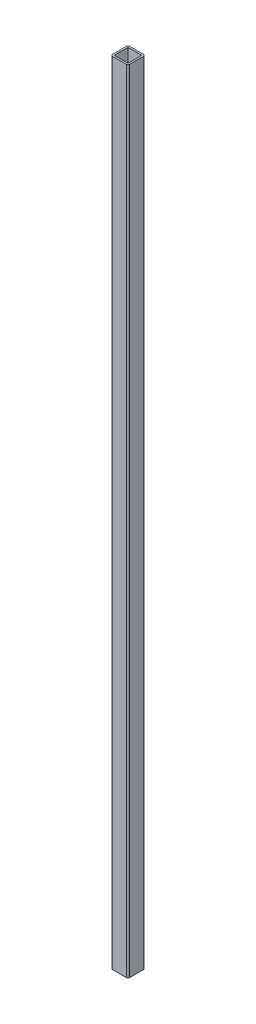
ISO-10303-21;
HEADER;
FILE_DESCRIPTION(('STEP AP214'),'2;1');
FILE_NAME('part.step','',(''),(''),'','','');
FILE_SCHEMA(('AUTOMOTIVE_DESIGN { 1 0 10303 214 1 1 1 1 }'));
ENDSEC;
DATA;
#1=APPLICATION_CONTEXT('core data for automotive mechanical design processes');
#2=APPLICATION_PROTOCOL_DEFINITION('international standard','automotive_design',2000,#1);
#3=PRODUCT_CONTEXT('',#1,'mechanical');
#4=PRODUCT('Part','Part','',(#3));
#5=PRODUCT_RELATED_PRODUCT_CATEGORY('part','',(#4));
#6=PRODUCT_DEFINITION_FORMATION('','',#4);
#7=PRODUCT_DEFINITION_CONTEXT('part definition',#1,'design');
#8=PRODUCT_DEFINITION('design','',#6,#7);
#9=PRODUCT_DEFINITION_SHAPE('','',#8);
#10=(LENGTH_UNIT() NAMED_UNIT(*) SI_UNIT(.MILLI.,.METRE.));
#11=(NAMED_UNIT(*) PLANE_ANGLE_UNIT() SI_UNIT($,.RADIAN.));
#12=(NAMED_UNIT(*) SI_UNIT($,.STERADIAN.) SOLID_ANGLE_UNIT());
#13=UNCERTAINTY_MEASURE_WITH_UNIT(LENGTH_MEASURE(1.E-05),#10,'distance_accuracy_value','');
#14=(GEOMETRIC_REPRESENTATION_CONTEXT(3) GLOBAL_UNCERTAINTY_ASSIGNED_CONTEXT((#13)) GLOBAL_UNIT_ASSIGNED_CONTEXT((#10,
#11,#12)) REPRESENTATION_CONTEXT('',''));
#15=CARTESIAN_POINT('',(0.,0.,0.));
#16=DIRECTION('',(0.,0.,1.));
#17=DIRECTION('',(1.,0.,0.));
#18=AXIS2_PLACEMENT_3D('',#15,#16,#17);
#19=CARTESIAN_POINT('',(12.7,1168.4,-12.7));
#20=DIRECTION('',(0.,0.,1.));
#21=DIRECTION('',(1.,0.,0.));
#22=AXIS2_PLACEMENT_3D('',#19,#20,#21);
#23=PLANE('',#22);
#24=DIRECTION('',(-1.,0.,0.));
#25=VECTOR('',#24,1.);
#26=CARTESIAN_POINT('',(12.7,1168.4,-12.7));
#27=LINE('',#26,#25);
#28=CARTESIAN_POINT('',(10.16,1168.4,-12.7));
#29=VERTEX_POINT('',#28);
#30=CARTESIAN_POINT('',(-10.16,1168.4,-12.7));
#31=VERTEX_POINT('',#30);
#32=EDGE_CURVE('E169',#29,#31,#27,.T.);
#33=ORIENTED_EDGE('',*,*,#32,.F.);
#34=DIRECTION('',(0.,-1.,0.));
#35=VECTOR('',#34,1.);
#36=CARTESIAN_POINT('',(10.16,0.,-12.7));
#37=LINE('',#36,#35);
#38=CARTESIAN_POINT('',(10.16,0.,-12.7));
#39=VERTEX_POINT('',#38);
#40=EDGE_CURVE('E11',#29,#39,#37,.T.);
#41=ORIENTED_EDGE('',*,*,#40,.T.);
#42=DIRECTION('',(-1.,0.,0.));
#43=VECTOR('',#42,1.);
#44=CARTESIAN_POINT('',(12.7,0.,-12.7));
#45=LINE('',#44,#43);
#46=CARTESIAN_POINT('',(-10.16,0.,-12.7));
#47=VERTEX_POINT('',#46);
#48=EDGE_CURVE('E182',#39,#47,#45,.T.);
#49=ORIENTED_EDGE('',*,*,#48,.T.);
#50=DIRECTION('',(0.,-1.,0.));
#51=VECTOR('',#50,1.);
#52=CARTESIAN_POINT('',(-10.16,1168.4,-12.7));
#53=LINE('',#52,#51);
#54=EDGE_CURVE('E47',#47,#31,#53,.F.);
#55=ORIENTED_EDGE('',*,*,#54,.T.);
#56=EDGE_LOOP('',(#33,#41,#49,#55));
#57=FACE_BOUND('',#56,.T.);
#58=ADVANCED_FACE('F39',(#57),#23,.F.);
#59=CARTESIAN_POINT('',(-12.7,1168.4,-12.7));
#60=DIRECTION('',(1.,0.,0.));
#61=DIRECTION('',(0.,0.,-1.));
#62=AXIS2_PLACEMENT_3D('',#59,#60,#61);
#63=PLANE('',#62);
#64=DIRECTION('',(0.,0.,1.));
#65=VECTOR('',#64,1.);
#66=CARTESIAN_POINT('',(-12.7,0.,-12.7));
#67=LINE('',#66,#65);
#68=CARTESIAN_POINT('',(-12.7,0.,-10.16));
#69=VERTEX_POINT('',#68);
#70=CARTESIAN_POINT('',(-12.7,0.,10.16));
#71=VERTEX_POINT('',#70);
#72=EDGE_CURVE('E185',#69,#71,#67,.T.);
#73=ORIENTED_EDGE('',*,*,#72,.T.);
#74=DIRECTION('',(0.,-1.,0.));
#75=VECTOR('',#74,1.);
#76=CARTESIAN_POINT('',(-12.7,1168.4,10.16));
#77=LINE('',#76,#75);
#78=CARTESIAN_POINT('',(-12.7,1168.4,10.16));
#79=VERTEX_POINT('',#78);
#80=EDGE_CURVE('E208',#71,#79,#77,.F.);
#81=ORIENTED_EDGE('',*,*,#80,.T.);
#82=DIRECTION('',(0.,0.,1.));
#83=VECTOR('',#82,1.);
#84=CARTESIAN_POINT('',(-12.7,1168.4,-12.7));
#85=LINE('',#84,#83);
#86=CARTESIAN_POINT('',(-12.7,1168.4,-10.16));
#87=VERTEX_POINT('',#86);
#88=EDGE_CURVE('E172',#87,#79,#85,.T.);
#89=ORIENTED_EDGE('',*,*,#88,.F.);
#90=DIRECTION('',(0.,-1.,0.));
#91=VECTOR('',#90,1.);
#92=CARTESIAN_POINT('',(-12.7,1168.4,-10.16));
#93=LINE('',#92,#91);
#94=EDGE_CURVE('E205',#87,#69,#93,.T.);
#95=ORIENTED_EDGE('',*,*,#94,.T.);
#96=EDGE_LOOP('',(#73,#81,#89,#95));
#97=FACE_BOUND('',#96,.T.);
#98=ADVANCED_FACE('F233',(#97),#63,.F.);
#99=CARTESIAN_POINT('',(12.7,1168.4,12.7));
#100=DIRECTION('',(0.,0.,1.));
#101=DIRECTION('',(1.,0.,0.));
#102=AXIS2_PLACEMENT_3D('',#99,#100,#101);
#103=PLANE('',#102);
#104=DIRECTION('',(-1.,0.,0.));
#105=VECTOR('',#104,1.);
#106=CARTESIAN_POINT('',(12.7,1168.4,12.7));
#107=LINE('',#106,#105);
#108=CARTESIAN_POINT('',(10.16,1168.4,12.7));
#109=VERTEX_POINT('',#108);
#110=CARTESIAN_POINT('',(-10.16,1168.4,12.7));
#111=VERTEX_POINT('',#110);
#112=EDGE_CURVE('E176',#109,#111,#107,.T.);
#113=ORIENTED_EDGE('',*,*,#112,.T.);
#114=DIRECTION('',(0.,-1.,0.));
#115=VECTOR('',#114,1.);
#116=CARTESIAN_POINT('',(-10.16,0.,12.7));
#117=LINE('',#116,#115);
#118=CARTESIAN_POINT('',(-10.16,0.,12.7));
#119=VERTEX_POINT('',#118);
#120=EDGE_CURVE('E194',#111,#119,#117,.T.);
#121=ORIENTED_EDGE('',*,*,#120,.T.);
#122=DIRECTION('',(-1.,0.,0.));
#123=VECTOR('',#122,1.);
#124=CARTESIAN_POINT('',(12.7,0.,12.7));
#125=LINE('',#124,#123);
#126=CARTESIAN_POINT('',(10.16,0.,12.7));
#127=VERTEX_POINT('',#126);
#128=EDGE_CURVE('E188',#127,#119,#125,.T.);
#129=ORIENTED_EDGE('',*,*,#128,.F.);
#130=DIRECTION('',(0.,-1.,0.));
#131=VECTOR('',#130,1.);
#132=CARTESIAN_POINT('',(10.16,1168.4,12.7));
#133=LINE('',#132,#131);
#134=EDGE_CURVE('E181',#127,#109,#133,.F.);
#135=ORIENTED_EDGE('',*,*,#134,.T.);
#136=EDGE_LOOP('',(#113,#121,#129,#135));
#137=FACE_BOUND('',#136,.T.);
#138=ADVANCED_FACE('F241',(#137),#103,.T.);
#139=CARTESIAN_POINT('',(12.7,1168.4,-12.7));
#140=DIRECTION('',(1.,0.,0.));
#141=DIRECTION('',(0.,0.,-1.));
#142=AXIS2_PLACEMENT_3D('',#139,#140,#141);
#143=PLANE('',#142);
#144=DIRECTION('',(0.,0.,1.));
#145=VECTOR('',#144,1.);
#146=CARTESIAN_POINT('',(12.7,1168.4,-12.7));
#147=LINE('',#146,#145);
#148=CARTESIAN_POINT('',(12.7,1168.4,-10.16));
#149=VERTEX_POINT('',#148);
#150=CARTESIAN_POINT('',(12.7,1168.4,10.16));
#151=VERTEX_POINT('',#150);
#152=EDGE_CURVE('E179',#149,#151,#147,.T.);
#153=ORIENTED_EDGE('',*,*,#152,.T.);
#154=DIRECTION('',(0.,-1.,0.));
#155=VECTOR('',#154,1.);
#156=CARTESIAN_POINT('',(12.7,1168.4,10.16));
#157=LINE('',#156,#155);
#158=CARTESIAN_POINT('',(12.7,0.,10.16));
#159=VERTEX_POINT('',#158);
#160=EDGE_CURVE('E218',#151,#159,#157,.T.);
#161=ORIENTED_EDGE('',*,*,#160,.T.);
#162=DIRECTION('',(0.,0.,1.));
#163=VECTOR('',#162,1.);
#164=CARTESIAN_POINT('',(12.7,0.,-12.7));
#165=LINE('',#164,#163);
#166=CARTESIAN_POINT('',(12.7,0.,-10.16));
#167=VERTEX_POINT('',#166);
#168=EDGE_CURVE('E173',#167,#159,#165,.T.);
#169=ORIENTED_EDGE('',*,*,#168,.F.);
#170=DIRECTION('',(0.,-1.,0.));
#171=VECTOR('',#170,1.);
#172=CARTESIAN_POINT('',(12.7,1168.4,-10.16));
#173=LINE('',#172,#171);
#174=EDGE_CURVE('E61',#167,#149,#173,.F.);
#175=ORIENTED_EDGE('',*,*,#174,.T.);
#176=EDGE_LOOP('',(#153,#161,#169,#175));
#177=FACE_BOUND('',#176,.T.);
#178=ADVANCED_FACE('F246',(#177),#143,.T.);
#179=CARTESIAN_POINT('',(0.,1168.4,0.));
#180=DIRECTION('',(0.,1.,0.));
#181=DIRECTION('',(0.,0.,1.));
#182=AXIS2_PLACEMENT_3D('',#179,#180,#181);
#183=PLANE('',#182);
#184=DIRECTION('',(-1.,0.,0.));
#185=VECTOR('',#184,1.);
#186=CARTESIAN_POINT('',(12.7,1168.4,-10.16));
#187=LINE('',#186,#185);
#188=CARTESIAN_POINT('',(10.16,1168.4,-10.16));
#189=VERTEX_POINT('',#188);
#190=CARTESIAN_POINT('',(-10.16,1168.4,-10.16));
#191=VERTEX_POINT('',#190);
#192=EDGE_CURVE('E156',#189,#191,#187,.T.);
#193=ORIENTED_EDGE('',*,*,#192,.F.);
#194=DIRECTION('',(0.,0.,1.));
#195=VECTOR('',#194,1.);
#196=CARTESIAN_POINT('',(10.16,1168.4,-12.7));
#197=LINE('',#196,#195);
#198=CARTESIAN_POINT('',(10.16,1168.4,10.16));
#199=VERTEX_POINT('',#198);
#200=EDGE_CURVE('E138',#189,#199,#197,.T.);
#201=ORIENTED_EDGE('',*,*,#200,.T.);
#202=DIRECTION('',(-1.,0.,0.));
#203=VECTOR('',#202,1.);
#204=CARTESIAN_POINT('',(12.7,1168.4,10.16));
#205=LINE('',#204,#203);
#206=CARTESIAN_POINT('',(-10.16,1168.4,10.16));
#207=VERTEX_POINT('',#206);
#208=EDGE_CURVE('E165',#199,#207,#205,.T.);
#209=ORIENTED_EDGE('',*,*,#208,.T.);
#210=DIRECTION('',(0.,0.,1.));
#211=VECTOR('',#210,1.);
#212=CARTESIAN_POINT('',(-10.16,1168.4,-12.7));
#213=LINE('',#212,#211);
#214=EDGE_CURVE('E158',#191,#207,#213,.T.);
#215=ORIENTED_EDGE('',*,*,#214,.F.);
#216=EDGE_LOOP('',(#193,#201,#209,#215));
#217=FACE_BOUND('',#216,.T.);
#218=ORIENTED_EDGE('',*,*,#88,.T.);
#219=CARTESIAN_POINT('',(-10.16,1168.4,10.16));
#220=DIRECTION('',(0.,1.,0.));
#221=DIRECTION('',(0.,0.,1.));
#222=AXIS2_PLACEMENT_3D('',#219,#220,#221);
#223=CIRCLE('',#222,2.54);
#224=EDGE_CURVE('E215',#79,#111,#223,.T.);
#225=ORIENTED_EDGE('',*,*,#224,.T.);
#226=ORIENTED_EDGE('',*,*,#112,.F.);
#227=CARTESIAN_POINT('',(10.16,1168.4,10.16));
#228=DIRECTION('',(0.,1.,0.));
#229=DIRECTION('',(0.,0.,1.));
#230=AXIS2_PLACEMENT_3D('',#227,#228,#229);
#231=CIRCLE('',#230,2.54);
#232=EDGE_CURVE('E54',#109,#151,#231,.T.);
#233=ORIENTED_EDGE('',*,*,#232,.T.);
#234=ORIENTED_EDGE('',*,*,#152,.F.);
#235=CARTESIAN_POINT('',(10.16,1168.4,-10.16));
#236=DIRECTION('',(0.,1.,0.));
#237=DIRECTION('',(0.,0.,1.));
#238=AXIS2_PLACEMENT_3D('',#235,#236,#237);
#239=CIRCLE('',#238,2.54);
#240=EDGE_CURVE('E212',#149,#29,#239,.T.);
#241=ORIENTED_EDGE('',*,*,#240,.T.);
#242=ORIENTED_EDGE('',*,*,#32,.T.);
#243=CARTESIAN_POINT('',(-10.16,1168.4,-10.16));
#244=DIRECTION('',(0.,1.,0.));
#245=DIRECTION('',(0.,0.,1.));
#246=AXIS2_PLACEMENT_3D('',#243,#244,#245);
#247=CIRCLE('',#246,2.54);
#248=EDGE_CURVE('E210',#31,#87,#247,.T.);
#249=ORIENTED_EDGE('',*,*,#248,.T.);
#250=EDGE_LOOP('',(#218,#225,#226,#233,#234,#241,#242,#249));
#251=FACE_BOUND('',#250,.T.);
#252=ADVANCED_FACE('F227',(#217,#251),#183,.T.);
#253=CARTESIAN_POINT('',(0.,0.,0.));
#254=DIRECTION('',(0.,1.,0.));
#255=DIRECTION('',(0.,0.,1.));
#256=AXIS2_PLACEMENT_3D('',#253,#254,#255);
#257=PLANE('',#256);
#258=DIRECTION('',(0.,0.,1.));
#259=VECTOR('',#258,1.);
#260=CARTESIAN_POINT('',(10.16,0.,-12.7));
#261=LINE('',#260,#259);
#262=CARTESIAN_POINT('',(10.16,0.,-10.16));
#263=VERTEX_POINT('',#262);
#264=CARTESIAN_POINT('',(10.16,0.,10.16));
#265=VERTEX_POINT('',#264);
#266=EDGE_CURVE('E135',#263,#265,#261,.T.);
#267=ORIENTED_EDGE('',*,*,#266,.F.);
#268=DIRECTION('',(-1.,0.,0.));
#269=VECTOR('',#268,1.);
#270=CARTESIAN_POINT('',(12.7,0.,-10.16));
#271=LINE('',#270,#269);
#272=CARTESIAN_POINT('',(-10.16,0.,-10.16));
#273=VERTEX_POINT('',#272);
#274=EDGE_CURVE('E145',#263,#273,#271,.T.);
#275=ORIENTED_EDGE('',*,*,#274,.T.);
#276=DIRECTION('',(0.,0.,1.));
#277=VECTOR('',#276,1.);
#278=CARTESIAN_POINT('',(-10.16,0.,-12.7));
#279=LINE('',#278,#277);
#280=CARTESIAN_POINT('',(-10.16,0.,10.16));
#281=VERTEX_POINT('',#280);
#282=EDGE_CURVE('E151',#273,#281,#279,.T.);
#283=ORIENTED_EDGE('',*,*,#282,.T.);
#284=DIRECTION('',(-1.,0.,0.));
#285=VECTOR('',#284,1.);
#286=CARTESIAN_POINT('',(12.7,0.,10.16));
#287=LINE('',#286,#285);
#288=EDGE_CURVE('E155',#265,#281,#287,.T.);
#289=ORIENTED_EDGE('',*,*,#288,.F.);
#290=EDGE_LOOP('',(#267,#275,#283,#289));
#291=FACE_BOUND('',#290,.T.);
#292=ORIENTED_EDGE('',*,*,#128,.T.);
#293=CARTESIAN_POINT('',(-10.16,0.,10.16));
#294=DIRECTION('',(0.,1.,0.));
#295=DIRECTION('',(0.,0.,1.));
#296=AXIS2_PLACEMENT_3D('',#293,#294,#295);
#297=CIRCLE('',#296,2.54);
#298=EDGE_CURVE('E203',#119,#71,#297,.F.);
#299=ORIENTED_EDGE('',*,*,#298,.T.);
#300=ORIENTED_EDGE('',*,*,#72,.F.);
#301=CARTESIAN_POINT('',(-10.16,0.,-10.16));
#302=DIRECTION('',(0.,1.,0.));
#303=DIRECTION('',(0.,0.,1.));
#304=AXIS2_PLACEMENT_3D('',#301,#302,#303);
#305=CIRCLE('',#304,2.54);
#306=EDGE_CURVE('E197',#69,#47,#305,.F.);
#307=ORIENTED_EDGE('',*,*,#306,.T.);
#308=ORIENTED_EDGE('',*,*,#48,.F.);
#309=CARTESIAN_POINT('',(10.16,0.,-10.16));
#310=DIRECTION('',(0.,1.,0.));
#311=DIRECTION('',(0.,0.,1.));
#312=AXIS2_PLACEMENT_3D('',#309,#310,#311);
#313=CIRCLE('',#312,2.54);
#314=EDGE_CURVE('E199',#39,#167,#313,.F.);
#315=ORIENTED_EDGE('',*,*,#314,.T.);
#316=ORIENTED_EDGE('',*,*,#168,.T.);
#317=CARTESIAN_POINT('',(10.16,0.,10.16));
#318=DIRECTION('',(0.,1.,0.));
#319=DIRECTION('',(0.,0.,1.));
#320=AXIS2_PLACEMENT_3D('',#317,#318,#319);
#321=CIRCLE('',#320,2.54);
#322=EDGE_CURVE('E201',#159,#127,#321,.F.);
#323=ORIENTED_EDGE('',*,*,#322,.T.);
#324=EDGE_LOOP('',(#292,#299,#300,#307,#308,#315,#316,#323));
#325=FACE_BOUND('',#324,.T.);
#326=ADVANCED_FACE('F153',(#291,#325),#257,.F.);
#327=CARTESIAN_POINT('',(12.7,1168.4,-10.16));
#328=DIRECTION('',(0.,0.,1.));
#329=DIRECTION('',(1.,0.,0.));
#330=AXIS2_PLACEMENT_3D('',#327,#328,#329);
#331=PLANE('',#330);
#332=ORIENTED_EDGE('',*,*,#274,.F.);
#333=DIRECTION('',(0.,-1.,0.));
#334=VECTOR('',#333,1.);
#335=CARTESIAN_POINT('',(10.16,1168.4,-10.16));
#336=LINE('',#335,#334);
#337=EDGE_CURVE('E130',#189,#263,#336,.T.);
#338=ORIENTED_EDGE('',*,*,#337,.F.);
#339=ORIENTED_EDGE('',*,*,#192,.T.);
#340=DIRECTION('',(0.,-1.,0.));
#341=VECTOR('',#340,1.);
#342=CARTESIAN_POINT('',(-10.16,1168.4,-10.16));
#343=LINE('',#342,#341);
#344=EDGE_CURVE('E148',#191,#273,#343,.T.);
#345=ORIENTED_EDGE('',*,*,#344,.T.);
#346=EDGE_LOOP('',(#332,#338,#339,#345));
#347=FACE_BOUND('',#346,.T.);
#348=ADVANCED_FACE('F146',(#347),#331,.T.);
#349=CARTESIAN_POINT('',(-10.16,1168.4,-12.7));
#350=DIRECTION('',(1.,0.,0.));
#351=DIRECTION('',(0.,0.,-1.));
#352=AXIS2_PLACEMENT_3D('',#349,#350,#351);
#353=PLANE('',#352);
#354=ORIENTED_EDGE('',*,*,#282,.F.);
#355=ORIENTED_EDGE('',*,*,#344,.F.);
#356=ORIENTED_EDGE('',*,*,#214,.T.);
#357=DIRECTION('',(0.,-1.,0.));
#358=VECTOR('',#357,1.);
#359=CARTESIAN_POINT('',(-10.16,1168.4,10.16));
#360=LINE('',#359,#358);
#361=EDGE_CURVE('E372',#207,#281,#360,.T.);
#362=ORIENTED_EDGE('',*,*,#361,.T.);
#363=EDGE_LOOP('',(#354,#355,#356,#362));
#364=FACE_BOUND('',#363,.T.);
#365=ADVANCED_FACE('F272',(#364),#353,.T.);
#366=CARTESIAN_POINT('',(12.7,1168.4,10.16));
#367=DIRECTION('',(0.,0.,1.));
#368=DIRECTION('',(1.,0.,0.));
#369=AXIS2_PLACEMENT_3D('',#366,#367,#368);
#370=PLANE('',#369);
#371=ORIENTED_EDGE('',*,*,#288,.T.);
#372=ORIENTED_EDGE('',*,*,#361,.F.);
#373=ORIENTED_EDGE('',*,*,#208,.F.);
#374=DIRECTION('',(0.,-1.,0.));
#375=VECTOR('',#374,1.);
#376=CARTESIAN_POINT('',(10.16,1168.4,10.16));
#377=LINE('',#376,#375);
#378=EDGE_CURVE('E141',#199,#265,#377,.T.);
#379=ORIENTED_EDGE('',*,*,#378,.T.);
#380=EDGE_LOOP('',(#371,#372,#373,#379));
#381=FACE_BOUND('',#380,.T.);
#382=ADVANCED_FACE('F267',(#381),#370,.F.);
#383=CARTESIAN_POINT('',(10.16,1168.4,-12.7));
#384=DIRECTION('',(1.,0.,0.));
#385=DIRECTION('',(0.,0.,-1.));
#386=AXIS2_PLACEMENT_3D('',#383,#384,#385);
#387=PLANE('',#386);
#388=ORIENTED_EDGE('',*,*,#266,.T.);
#389=ORIENTED_EDGE('',*,*,#378,.F.);
#390=ORIENTED_EDGE('',*,*,#200,.F.);
#391=ORIENTED_EDGE('',*,*,#337,.T.);
#392=EDGE_LOOP('',(#388,#389,#390,#391));
#393=FACE_BOUND('',#392,.T.);
#394=ADVANCED_FACE('F132',(#393),#387,.F.);
#395=CARTESIAN_POINT('',(-10.16,1168.4,10.16));
#396=DIRECTION('',(0.,1.,0.));
#397=DIRECTION('',(0.,0.,1.));
#398=AXIS2_PLACEMENT_3D('',#395,#396,#397);
#399=CYLINDRICAL_SURFACE('',#398,2.54);
#400=ORIENTED_EDGE('',*,*,#224,.F.);
#401=ORIENTED_EDGE('',*,*,#80,.F.);
#402=ORIENTED_EDGE('',*,*,#298,.F.);
#403=ORIENTED_EDGE('',*,*,#120,.F.);
#404=EDGE_LOOP('',(#400,#401,#402,#403));
#405=FACE_BOUND('',#404,.T.);
#406=ADVANCED_FACE('F239',(#405),#399,.T.);
#407=CARTESIAN_POINT('',(10.16,1168.4,10.16));
#408=DIRECTION('',(0.,-1.,0.));
#409=DIRECTION('',(0.,0.,-1.));
#410=AXIS2_PLACEMENT_3D('',#407,#408,#409);
#411=CYLINDRICAL_SURFACE('',#410,2.54);
#412=ORIENTED_EDGE('',*,*,#232,.F.);
#413=ORIENTED_EDGE('',*,*,#134,.F.);
#414=ORIENTED_EDGE('',*,*,#322,.F.);
#415=ORIENTED_EDGE('',*,*,#160,.F.);
#416=EDGE_LOOP('',(#412,#413,#414,#415));
#417=FACE_BOUND('',#416,.T.);
#418=ADVANCED_FACE('F245',(#417),#411,.T.);
#419=CARTESIAN_POINT('',(10.16,1168.4,-10.16));
#420=DIRECTION('',(0.,1.,0.));
#421=DIRECTION('',(0.,0.,1.));
#422=AXIS2_PLACEMENT_3D('',#419,#420,#421);
#423=CYLINDRICAL_SURFACE('',#422,2.54);
#424=ORIENTED_EDGE('',*,*,#240,.F.);
#425=ORIENTED_EDGE('',*,*,#174,.F.);
#426=ORIENTED_EDGE('',*,*,#314,.F.);
#427=ORIENTED_EDGE('',*,*,#40,.F.);
#428=EDGE_LOOP('',(#424,#425,#426,#427));
#429=FACE_BOUND('',#428,.T.);
#430=ADVANCED_FACE('F248',(#429),#423,.T.);
#431=CARTESIAN_POINT('',(-10.16,1168.4,-10.16));
#432=DIRECTION('',(0.,-1.,0.));
#433=DIRECTION('',(0.,0.,-1.));
#434=AXIS2_PLACEMENT_3D('',#431,#432,#433);
#435=CYLINDRICAL_SURFACE('',#434,2.54);
#436=ORIENTED_EDGE('',*,*,#248,.F.);
#437=ORIENTED_EDGE('',*,*,#54,.F.);
#438=ORIENTED_EDGE('',*,*,#306,.F.);
#439=ORIENTED_EDGE('',*,*,#94,.F.);
#440=EDGE_LOOP('',(#436,#437,#438,#439));
#441=FACE_BOUND('',#440,.T.);
#442=ADVANCED_FACE('F41',(#441),#435,.T.);
#443=CLOSED_SHELL('',(#58,#98,#138,#178,#252,#326,#348,#365,#382,#394,#406,#418,#430,#442));
#444=MANIFOLD_SOLID_BREP('B2',#443);
#445=ADVANCED_BREP_SHAPE_REPRESENTATION('',(#18,#444),#14);
#446=SHAPE_DEFINITION_REPRESENTATION(#9,#445);
ENDSEC;
END-ISO-10303-21;
